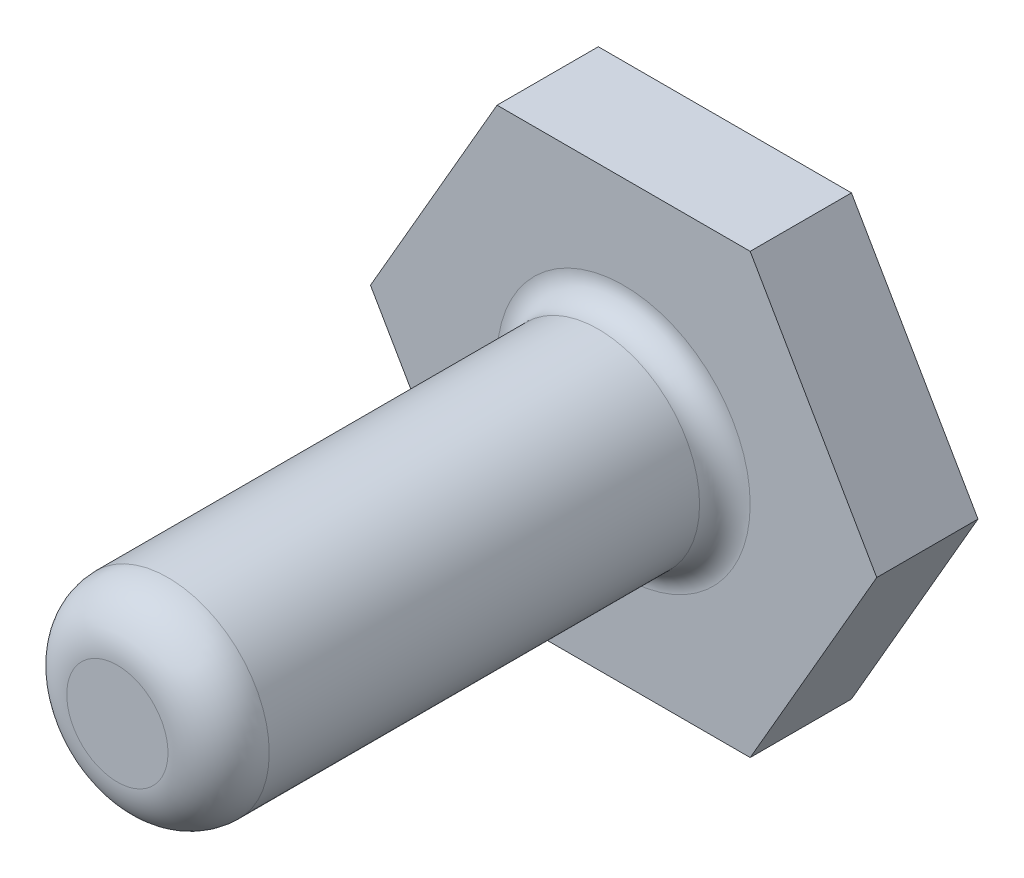
ISO-10303-21;
HEADER;
FILE_DESCRIPTION(('STEP AP214'),'2;1');
FILE_NAME('part.step','',(''),(''),'','','');
FILE_SCHEMA(('AUTOMOTIVE_DESIGN { 1 0 10303 214 1 1 1 1 }'));
ENDSEC;
DATA;
#1=APPLICATION_CONTEXT('core data for automotive mechanical design processes');
#2=APPLICATION_PROTOCOL_DEFINITION('international standard','automotive_design',2000,#1);
#3=PRODUCT_CONTEXT('',#1,'mechanical');
#4=PRODUCT('Part','Part','',(#3));
#5=PRODUCT_RELATED_PRODUCT_CATEGORY('part','',(#4));
#6=PRODUCT_DEFINITION_FORMATION('','',#4);
#7=PRODUCT_DEFINITION_CONTEXT('part definition',#1,'design');
#8=PRODUCT_DEFINITION('design','',#6,#7);
#9=PRODUCT_DEFINITION_SHAPE('','',#8);
#10=(LENGTH_UNIT() NAMED_UNIT(*) SI_UNIT(.MILLI.,.METRE.));
#11=(NAMED_UNIT(*) PLANE_ANGLE_UNIT() SI_UNIT($,.RADIAN.));
#12=(NAMED_UNIT(*) SI_UNIT($,.STERADIAN.) SOLID_ANGLE_UNIT());
#13=UNCERTAINTY_MEASURE_WITH_UNIT(LENGTH_MEASURE(1.E-05),#10,'distance_accuracy_value','');
#14=(GEOMETRIC_REPRESENTATION_CONTEXT(3) GLOBAL_UNCERTAINTY_ASSIGNED_CONTEXT((#13)) GLOBAL_UNIT_ASSIGNED_CONTEXT((#10,
#11,#12)) REPRESENTATION_CONTEXT('',''));
#15=CARTESIAN_POINT('',(0.,0.,0.));
#16=DIRECTION('',(0.,0.,1.));
#17=DIRECTION('',(1.,0.,0.));
#18=AXIS2_PLACEMENT_3D('',#15,#16,#17);
#19=CARTESIAN_POINT('',(5.,8.66025403784439,4.));
#20=DIRECTION('',(0.,0.,1.));
#21=DIRECTION('',(1.,0.,0.));
#22=AXIS2_PLACEMENT_3D('',#19,#20,#21);
#23=PLANE('',#22);
#24=CARTESIAN_POINT('',(0.,0.,4.));
#25=DIRECTION('',(0.,0.,1.));
#26=DIRECTION('',(1.,0.,0.));
#27=AXIS2_PLACEMENT_3D('',#24,#25,#26);
#28=CIRCLE('',#27,5.);
#29=CARTESIAN_POINT('',(5.,0.,4.));
#30=VERTEX_POINT('',#29);
#31=EDGE_CURVE('E141',#30,#30,#28,.F.);
#32=ORIENTED_EDGE('',*,*,#31,.T.);
#33=EDGE_LOOP('',(#32));
#34=FACE_BOUND('',#33,.T.);
#35=DIRECTION('',(-0.5,0.866025403784439,0.));
#36=VECTOR('',#35,1.);
#37=CARTESIAN_POINT('',(9.99999999999999,0.,4.));
#38=LINE('',#37,#36);
#39=CARTESIAN_POINT('',(9.99999999999999,0.,4.));
#40=VERTEX_POINT('',#39);
#41=CARTESIAN_POINT('',(5.,8.66025403784439,4.));
#42=VERTEX_POINT('',#41);
#43=EDGE_CURVE('E129',#40,#42,#38,.T.);
#44=ORIENTED_EDGE('',*,*,#43,.T.);
#45=DIRECTION('',(-1.,0.,0.));
#46=VECTOR('',#45,1.);
#47=CARTESIAN_POINT('',(5.,8.66025403784439,4.));
#48=LINE('',#47,#46);
#49=CARTESIAN_POINT('',(-5.,8.66025403784439,4.));
#50=VERTEX_POINT('',#49);
#51=EDGE_CURVE('E89',#42,#50,#48,.T.);
#52=ORIENTED_EDGE('',*,*,#51,.T.);
#53=DIRECTION('',(-0.5,-0.866025403784439,0.));
#54=VECTOR('',#53,1.);
#55=CARTESIAN_POINT('',(-5.,8.66025403784439,4.));
#56=LINE('',#55,#54);
#57=CARTESIAN_POINT('',(-10.,0.,4.));
#58=VERTEX_POINT('',#57);
#59=EDGE_CURVE('E101',#50,#58,#56,.T.);
#60=ORIENTED_EDGE('',*,*,#59,.T.);
#61=DIRECTION('',(0.5,-0.866025403784438,0.));
#62=VECTOR('',#61,1.);
#63=CARTESIAN_POINT('',(-10.,0.,4.));
#64=LINE('',#63,#62);
#65=CARTESIAN_POINT('',(-4.99999999999999,-8.66025403784439,4.));
#66=VERTEX_POINT('',#65);
#67=EDGE_CURVE('E96',#58,#66,#64,.T.);
#68=ORIENTED_EDGE('',*,*,#67,.T.);
#69=DIRECTION('',(1.,0.,0.));
#70=VECTOR('',#69,1.);
#71=CARTESIAN_POINT('',(-4.99999999999999,-8.66025403784439,4.));
#72=LINE('',#71,#70);
#73=CARTESIAN_POINT('',(5.,-8.66025403784439,4.));
#74=VERTEX_POINT('',#73);
#75=EDGE_CURVE('E99',#66,#74,#72,.T.);
#76=ORIENTED_EDGE('',*,*,#75,.T.);
#77=DIRECTION('',(0.499999999999999,0.866025403784439,0.));
#78=VECTOR('',#77,1.);
#79=CARTESIAN_POINT('',(5.,-8.66025403784439,4.));
#80=LINE('',#79,#78);
#81=EDGE_CURVE('E51',#74,#40,#80,.T.);
#82=ORIENTED_EDGE('',*,*,#81,.T.);
#83=EDGE_LOOP('',(#44,#52,#60,#68,#76,#82));
#84=FACE_BOUND('',#83,.T.);
#85=ADVANCED_FACE('F34',(#34,#84),#23,.T.);
#86=CARTESIAN_POINT('',(9.99999999999999,0.,4.));
#87=DIRECTION('',(-0.866025403784439,-0.5,0.));
#88=DIRECTION('',(0.5,-0.866025403784439,0.));
#89=AXIS2_PLACEMENT_3D('',#86,#87,#88);
#90=PLANE('',#89);
#91=DIRECTION('',(-0.5,0.866025403784439,0.));
#92=VECTOR('',#91,1.);
#93=CARTESIAN_POINT('',(9.99999999999999,0.,0.));
#94=LINE('',#93,#92);
#95=CARTESIAN_POINT('',(9.99999999999999,0.,0.));
#96=VERTEX_POINT('',#95);
#97=CARTESIAN_POINT('',(5.,8.66025403784439,0.));
#98=VERTEX_POINT('',#97);
#99=EDGE_CURVE('E119',#96,#98,#94,.T.);
#100=ORIENTED_EDGE('',*,*,#99,.T.);
#101=DIRECTION('',(0.,0.,-1.));
#102=VECTOR('',#101,1.);
#103=CARTESIAN_POINT('',(5.,8.66025403784439,4.));
#104=LINE('',#103,#102);
#105=EDGE_CURVE('E136',#42,#98,#104,.T.);
#106=ORIENTED_EDGE('',*,*,#105,.F.);
#107=ORIENTED_EDGE('',*,*,#43,.F.);
#108=DIRECTION('',(0.,0.,-1.));
#109=VECTOR('',#108,1.);
#110=CARTESIAN_POINT('',(9.99999999999999,0.,4.));
#111=LINE('',#110,#109);
#112=EDGE_CURVE('E115',#40,#96,#111,.T.);
#113=ORIENTED_EDGE('',*,*,#112,.T.);
#114=EDGE_LOOP('',(#100,#106,#107,#113));
#115=FACE_BOUND('',#114,.T.);
#116=ADVANCED_FACE('F157',(#115),#90,.F.);
#117=CARTESIAN_POINT('',(5.,8.66025403784439,4.));
#118=DIRECTION('',(0.,-1.,0.));
#119=DIRECTION('',(0.,0.,-1.));
#120=AXIS2_PLACEMENT_3D('',#117,#118,#119);
#121=PLANE('',#120);
#122=DIRECTION('',(-1.,0.,0.));
#123=VECTOR('',#122,1.);
#124=CARTESIAN_POINT('',(5.,8.66025403784439,0.));
#125=LINE('',#124,#123);
#126=CARTESIAN_POINT('',(-5.,8.66025403784439,0.));
#127=VERTEX_POINT('',#126);
#128=EDGE_CURVE('E122',#98,#127,#125,.T.);
#129=ORIENTED_EDGE('',*,*,#128,.T.);
#130=DIRECTION('',(0.,0.,-1.));
#131=VECTOR('',#130,1.);
#132=CARTESIAN_POINT('',(-5.,8.66025403784439,4.));
#133=LINE('',#132,#131);
#134=EDGE_CURVE('E133',#50,#127,#133,.T.);
#135=ORIENTED_EDGE('',*,*,#134,.F.);
#136=ORIENTED_EDGE('',*,*,#51,.F.);
#137=ORIENTED_EDGE('',*,*,#105,.T.);
#138=EDGE_LOOP('',(#129,#135,#136,#137));
#139=FACE_BOUND('',#138,.T.);
#140=ADVANCED_FACE('F163',(#139),#121,.F.);
#141=CARTESIAN_POINT('',(-5.,8.66025403784439,4.));
#142=DIRECTION('',(0.866025403784439,-0.5,0.));
#143=DIRECTION('',(0.5,0.866025403784439,0.));
#144=AXIS2_PLACEMENT_3D('',#141,#142,#143);
#145=PLANE('',#144);
#146=DIRECTION('',(-0.5,-0.866025403784439,0.));
#147=VECTOR('',#146,1.);
#148=CARTESIAN_POINT('',(-5.,8.66025403784439,0.));
#149=LINE('',#148,#147);
#150=CARTESIAN_POINT('',(-10.,0.,0.));
#151=VERTEX_POINT('',#150);
#152=EDGE_CURVE('E124',#127,#151,#149,.T.);
#153=ORIENTED_EDGE('',*,*,#152,.T.);
#154=DIRECTION('',(0.,0.,-1.));
#155=VECTOR('',#154,1.);
#156=CARTESIAN_POINT('',(-10.,0.,4.));
#157=LINE('',#156,#155);
#158=EDGE_CURVE('E110',#58,#151,#157,.T.);
#159=ORIENTED_EDGE('',*,*,#158,.F.);
#160=ORIENTED_EDGE('',*,*,#59,.F.);
#161=ORIENTED_EDGE('',*,*,#134,.T.);
#162=EDGE_LOOP('',(#153,#159,#160,#161));
#163=FACE_BOUND('',#162,.T.);
#164=ADVANCED_FACE('F181',(#163),#145,.F.);
#165=CARTESIAN_POINT('',(-10.,0.,4.));
#166=DIRECTION('',(0.866025403784439,0.5,0.));
#167=DIRECTION('',(-0.5,0.866025403784438,0.));
#168=AXIS2_PLACEMENT_3D('',#165,#166,#167);
#169=PLANE('',#168);
#170=DIRECTION('',(0.5,-0.866025403784438,0.));
#171=VECTOR('',#170,1.);
#172=CARTESIAN_POINT('',(-10.,0.,0.));
#173=LINE('',#172,#171);
#174=CARTESIAN_POINT('',(-4.99999999999999,-8.66025403784439,0.));
#175=VERTEX_POINT('',#174);
#176=EDGE_CURVE('E109',#151,#175,#173,.T.);
#177=ORIENTED_EDGE('',*,*,#176,.T.);
#178=DIRECTION('',(0.,0.,-1.));
#179=VECTOR('',#178,1.);
#180=CARTESIAN_POINT('',(-4.99999999999999,-8.66025403784439,4.));
#181=LINE('',#180,#179);
#182=EDGE_CURVE('E106',#66,#175,#181,.T.);
#183=ORIENTED_EDGE('',*,*,#182,.F.);
#184=ORIENTED_EDGE('',*,*,#67,.F.);
#185=ORIENTED_EDGE('',*,*,#158,.T.);
#186=EDGE_LOOP('',(#177,#183,#184,#185));
#187=FACE_BOUND('',#186,.T.);
#188=ADVANCED_FACE('F107',(#187),#169,.F.);
#189=CARTESIAN_POINT('',(-4.99999999999999,-8.66025403784439,4.));
#190=DIRECTION('',(0.,1.,0.));
#191=DIRECTION('',(0.,0.,1.));
#192=AXIS2_PLACEMENT_3D('',#189,#190,#191);
#193=PLANE('',#192);
#194=DIRECTION('',(1.,0.,0.));
#195=VECTOR('',#194,1.);
#196=CARTESIAN_POINT('',(-4.99999999999999,-8.66025403784439,0.));
#197=LINE('',#196,#195);
#198=CARTESIAN_POINT('',(5.,-8.66025403784439,0.));
#199=VERTEX_POINT('',#198);
#200=EDGE_CURVE('E74',#175,#199,#197,.T.);
#201=ORIENTED_EDGE('',*,*,#200,.T.);
#202=DIRECTION('',(0.,0.,-1.));
#203=VECTOR('',#202,1.);
#204=CARTESIAN_POINT('',(5.,-8.66025403784439,4.));
#205=LINE('',#204,#203);
#206=EDGE_CURVE('E111',#74,#199,#205,.T.);
#207=ORIENTED_EDGE('',*,*,#206,.F.);
#208=ORIENTED_EDGE('',*,*,#75,.F.);
#209=ORIENTED_EDGE('',*,*,#182,.T.);
#210=EDGE_LOOP('',(#201,#207,#208,#209));
#211=FACE_BOUND('',#210,.T.);
#212=ADVANCED_FACE('F113',(#211),#193,.F.);
#213=CARTESIAN_POINT('',(5.,-8.66025403784439,4.));
#214=DIRECTION('',(-0.866025403784439,0.499999999999999,0.));
#215=DIRECTION('',(-0.499999999999999,-0.866025403784439,0.));
#216=AXIS2_PLACEMENT_3D('',#213,#214,#215);
#217=PLANE('',#216);
#218=DIRECTION('',(0.499999999999999,0.866025403784439,0.));
#219=VECTOR('',#218,1.);
#220=CARTESIAN_POINT('',(5.,-8.66025403784439,0.));
#221=LINE('',#220,#219);
#222=EDGE_CURVE('E80',#199,#96,#221,.T.);
#223=ORIENTED_EDGE('',*,*,#222,.T.);
#224=ORIENTED_EDGE('',*,*,#112,.F.);
#225=ORIENTED_EDGE('',*,*,#81,.F.);
#226=ORIENTED_EDGE('',*,*,#206,.T.);
#227=EDGE_LOOP('',(#223,#224,#225,#226));
#228=FACE_BOUND('',#227,.T.);
#229=ADVANCED_FACE('F173',(#228),#217,.F.);
#230=CARTESIAN_POINT('',(5.,8.66025403784439,0.));
#231=DIRECTION('',(0.,0.,1.));
#232=DIRECTION('',(1.,0.,0.));
#233=AXIS2_PLACEMENT_3D('',#230,#231,#232);
#234=PLANE('',#233);
#235=ORIENTED_EDGE('',*,*,#99,.F.);
#236=ORIENTED_EDGE('',*,*,#222,.F.);
#237=ORIENTED_EDGE('',*,*,#200,.F.);
#238=ORIENTED_EDGE('',*,*,#176,.F.);
#239=ORIENTED_EDGE('',*,*,#152,.F.);
#240=ORIENTED_EDGE('',*,*,#128,.F.);
#241=EDGE_LOOP('',(#235,#236,#237,#238,#239,#240));
#242=FACE_BOUND('',#241,.T.);
#243=ADVANCED_FACE('F170',(#242),#234,.F.);
#244=CARTESIAN_POINT('',(0.,0.,24.));
#245=DIRECTION('',(0.,0.,-1.));
#246=DIRECTION('',(-1.,0.,0.));
#247=AXIS2_PLACEMENT_3D('',#244,#245,#246);
#248=CYLINDRICAL_SURFACE('',#247,4.);
#249=CARTESIAN_POINT('',(0.,0.,22.));
#250=DIRECTION('',(0.,0.,1.));
#251=DIRECTION('',(1.,0.,0.));
#252=AXIS2_PLACEMENT_3D('',#249,#250,#251);
#253=CIRCLE('',#252,4.);
#254=CARTESIAN_POINT('',(4.,0.,22.));
#255=VERTEX_POINT('',#254);
#256=EDGE_CURVE('E11',#255,#255,#253,.F.);
#257=ORIENTED_EDGE('',*,*,#256,.T.);
#258=EDGE_LOOP('',(#257));
#259=FACE_BOUND('',#258,.T.);
#260=CARTESIAN_POINT('',(0.,0.,5.));
#261=DIRECTION('',(0.,0.,1.));
#262=DIRECTION('',(1.,0.,0.));
#263=AXIS2_PLACEMENT_3D('',#260,#261,#262);
#264=CIRCLE('',#263,4.);
#265=CARTESIAN_POINT('',(4.,0.,5.));
#266=VERTEX_POINT('',#265);
#267=EDGE_CURVE('E138',#266,#266,#264,.T.);
#268=ORIENTED_EDGE('',*,*,#267,.T.);
#269=EDGE_LOOP('',(#268));
#270=FACE_BOUND('',#269,.T.);
#271=ADVANCED_FACE('F168',(#259,#270),#248,.T.);
#272=CARTESIAN_POINT('',(0.,0.,24.));
#273=DIRECTION('',(0.,0.,1.));
#274=DIRECTION('',(1.,0.,0.));
#275=AXIS2_PLACEMENT_3D('',#272,#273,#274);
#276=PLANE('',#275);
#277=CARTESIAN_POINT('',(0.,0.,24.));
#278=DIRECTION('',(0.,0.,1.));
#279=DIRECTION('',(1.,0.,0.));
#280=AXIS2_PLACEMENT_3D('',#277,#278,#279);
#281=CIRCLE('',#280,2.);
#282=CARTESIAN_POINT('',(2.,0.,24.));
#283=VERTEX_POINT('',#282);
#284=EDGE_CURVE('E43',#283,#283,#281,.T.);
#285=ORIENTED_EDGE('',*,*,#284,.T.);
#286=EDGE_LOOP('',(#285));
#287=FACE_BOUND('',#286,.T.);
#288=ADVANCED_FACE('F146',(#287),#276,.T.);
#289=CARTESIAN_POINT('',(0.,0.,5.));
#290=DIRECTION('',(0.,0.,1.));
#291=DIRECTION('',(1.,0.,0.));
#292=AXIS2_PLACEMENT_3D('',#289,#290,#291);
#293=TOROIDAL_SURFACE('',#292,5.,1.);
#294=ORIENTED_EDGE('',*,*,#31,.F.);
#295=EDGE_LOOP('',(#294));
#296=FACE_BOUND('',#295,.T.);
#297=ORIENTED_EDGE('',*,*,#267,.F.);
#298=EDGE_LOOP('',(#297));
#299=FACE_BOUND('',#298,.T.);
#300=ADVANCED_FACE('F149',(#296,#299),#293,.F.);
#301=CARTESIAN_POINT('',(0.,0.,22.));
#302=DIRECTION('',(0.,0.,1.));
#303=DIRECTION('',(1.,0.,0.));
#304=AXIS2_PLACEMENT_3D('',#301,#302,#303);
#305=DEGENERATE_TOROIDAL_SURFACE('',#304,2.,2.,.T.);
#306=ORIENTED_EDGE('',*,*,#256,.F.);
#307=EDGE_LOOP('',(#306));
#308=FACE_BOUND('',#307,.T.);
#309=ORIENTED_EDGE('',*,*,#284,.F.);
#310=EDGE_LOOP('',(#309));
#311=FACE_BOUND('',#310,.T.);
#312=ADVANCED_FACE('F36',(#308,#311),#305,.T.);
#313=CLOSED_SHELL('',(#85,#116,#140,#164,#188,#212,#229,#243,#271,#288,#300,#312));
#314=MANIFOLD_SOLID_BREP('B2',#313);
#315=ADVANCED_BREP_SHAPE_REPRESENTATION('',(#18,#314),#14);
#316=SHAPE_DEFINITION_REPRESENTATION(#9,#315);
ENDSEC;
END-ISO-10303-21;
